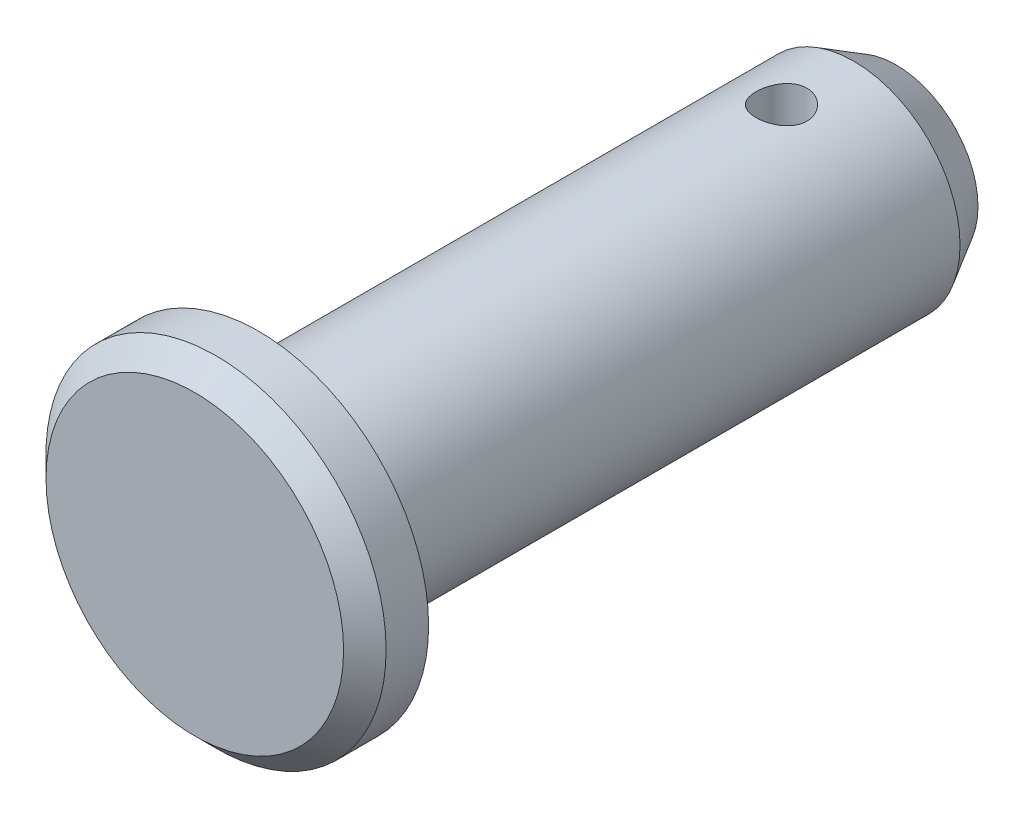
ISO-10303-21;
HEADER;
FILE_DESCRIPTION(('STEP AP214'),'2;1');
FILE_NAME('part.step','',(''),(''),'','','');
FILE_SCHEMA(('AUTOMOTIVE_DESIGN { 1 0 10303 214 1 1 1 1 }'));
ENDSEC;
DATA;
#1=APPLICATION_CONTEXT('core data for automotive mechanical design processes');
#2=APPLICATION_PROTOCOL_DEFINITION('international standard','automotive_design',2000,#1);
#3=PRODUCT_CONTEXT('',#1,'mechanical');
#4=PRODUCT('Part','Part','',(#3));
#5=PRODUCT_RELATED_PRODUCT_CATEGORY('part','',(#4));
#6=PRODUCT_DEFINITION_FORMATION('','',#4);
#7=PRODUCT_DEFINITION_CONTEXT('part definition',#1,'design');
#8=PRODUCT_DEFINITION('design','',#6,#7);
#9=PRODUCT_DEFINITION_SHAPE('','',#8);
#10=(LENGTH_UNIT() NAMED_UNIT(*) SI_UNIT(.MILLI.,.METRE.));
#11=(NAMED_UNIT(*) PLANE_ANGLE_UNIT() SI_UNIT($,.RADIAN.));
#12=(NAMED_UNIT(*) SI_UNIT($,.STERADIAN.) SOLID_ANGLE_UNIT());
#13=UNCERTAINTY_MEASURE_WITH_UNIT(LENGTH_MEASURE(1.E-05),#10,'distance_accuracy_value','');
#14=(GEOMETRIC_REPRESENTATION_CONTEXT(3) GLOBAL_UNCERTAINTY_ASSIGNED_CONTEXT((#13)) GLOBAL_UNIT_ASSIGNED_CONTEXT((#10,
#11,#12)) REPRESENTATION_CONTEXT('',''));
#15=CARTESIAN_POINT('',(0.,0.,0.));
#16=DIRECTION('',(0.,0.,1.));
#17=DIRECTION('',(1.,0.,0.));
#18=AXIS2_PLACEMENT_3D('',#15,#16,#17);
#19=CARTESIAN_POINT('',(0.,0.,8.25));
#20=DIRECTION('',(0.,0.,-1.));
#21=DIRECTION('',(-1.,0.,0.));
#22=AXIS2_PLACEMENT_3D('',#19,#20,#21);
#23=PLANE('',#22);
#24=CARTESIAN_POINT('',(0.,0.,8.25));
#25=DIRECTION('',(0.,0.,1.));
#26=DIRECTION('',(1.,0.,0.));
#27=AXIS2_PLACEMENT_3D('',#24,#25,#26);
#28=CIRCLE('',#27,3.5);
#29=CARTESIAN_POINT('',(3.5,0.,8.25));
#30=VERTEX_POINT('',#29);
#31=EDGE_CURVE('E10',#30,#30,#28,.T.);
#32=ORIENTED_EDGE('',*,*,#31,.T.);
#33=EDGE_LOOP('',(#32));
#34=FACE_BOUND('',#33,.T.);
#35=ADVANCED_FACE('F33',(#34),#23,.F.);
#36=CARTESIAN_POINT('',(0.,0.,7.75));
#37=DIRECTION('',(0.,0.,-1.));
#38=DIRECTION('',(-1.,0.,0.));
#39=AXIS2_PLACEMENT_3D('',#36,#37,#38);
#40=CONICAL_SURFACE('',#39,4.,0.785398163397449);
#41=ORIENTED_EDGE('',*,*,#31,.F.);
#42=EDGE_LOOP('',(#41));
#43=FACE_BOUND('',#42,.T.);
#44=CARTESIAN_POINT('',(0.,0.,7.75));
#45=DIRECTION('',(0.,0.,1.));
#46=DIRECTION('',(1.,0.,0.));
#47=AXIS2_PLACEMENT_3D('',#44,#45,#46);
#48=CIRCLE('',#47,4.);
#49=CARTESIAN_POINT('',(4.,0.,7.75));
#50=VERTEX_POINT('',#49);
#51=EDGE_CURVE('E45',#50,#50,#48,.T.);
#52=ORIENTED_EDGE('',*,*,#51,.T.);
#53=EDGE_LOOP('',(#52));
#54=FACE_BOUND('',#53,.T.);
#55=ADVANCED_FACE('F82',(#43,#54),#40,.T.);
#56=CARTESIAN_POINT('',(0.,0.,8.25));
#57=DIRECTION('',(0.,0.,1.));
#58=DIRECTION('',(1.,0.,0.));
#59=AXIS2_PLACEMENT_3D('',#56,#57,#58);
#60=CYLINDRICAL_SURFACE('',#59,4.);
#61=ORIENTED_EDGE('',*,*,#51,.F.);
#62=EDGE_LOOP('',(#61));
#63=FACE_BOUND('',#62,.T.);
#64=CARTESIAN_POINT('',(0.,0.,6.75));
#65=DIRECTION('',(0.,0.,1.));
#66=DIRECTION('',(1.,0.,0.));
#67=AXIS2_PLACEMENT_3D('',#64,#65,#66);
#68=CIRCLE('',#67,4.);
#69=CARTESIAN_POINT('',(4.,0.,6.75));
#70=VERTEX_POINT('',#69);
#71=EDGE_CURVE('E50',#70,#70,#68,.T.);
#72=ORIENTED_EDGE('',*,*,#71,.T.);
#73=EDGE_LOOP('',(#72));
#74=FACE_BOUND('',#73,.T.);
#75=ADVANCED_FACE('F86',(#63,#74),#60,.T.);
#76=CARTESIAN_POINT('',(0.,0.,6.75));
#77=DIRECTION('',(0.,0.,1.));
#78=DIRECTION('',(1.,0.,0.));
#79=AXIS2_PLACEMENT_3D('',#76,#77,#78);
#80=PLANE('',#79);
#81=ORIENTED_EDGE('',*,*,#71,.F.);
#82=EDGE_LOOP('',(#81));
#83=FACE_BOUND('',#82,.T.);
#84=CARTESIAN_POINT('',(0.,0.,6.75));
#85=DIRECTION('',(0.,0.,1.));
#86=DIRECTION('',(1.,0.,0.));
#87=AXIS2_PLACEMENT_3D('',#84,#85,#86);
#88=CIRCLE('',#87,2.5);
#89=CARTESIAN_POINT('',(2.5,0.,6.75));
#90=VERTEX_POINT('',#89);
#91=EDGE_CURVE('E103',#90,#90,#88,.T.);
#92=ORIENTED_EDGE('',*,*,#91,.T.);
#93=EDGE_LOOP('',(#92));
#94=FACE_BOUND('',#93,.T.);
#95=ADVANCED_FACE('F77',(#83,#94),#80,.F.);
#96=CARTESIAN_POINT('',(0.,0.,8.25));
#97=DIRECTION('',(0.,0.,1.));
#98=DIRECTION('',(1.,0.,0.));
#99=AXIS2_PLACEMENT_3D('',#96,#97,#98);
#100=CYLINDRICAL_SURFACE('',#99,2.5);
#101=CARTESIAN_POINT('',(0.,-2.5,-4.95));
#102=CARTESIAN_POINT('',(0.0331927858057433,-2.49999941429936,-4.95000100481545));
#103=CARTESIAN_POINT('',(0.0663970841856136,-2.49933231269719,-4.95276368204722));
#104=CARTESIAN_POINT('',(0.131856858194276,-2.49673567893865,-4.96372654791908));
#105=CARTESIAN_POINT('',(0.164111736642855,-2.49480536924329,-4.97193008559894));
#106=CARTESIAN_POINT('',(0.226717678942803,-2.48989646416393,-4.99349846690087));
#107=CARTESIAN_POINT('',(0.257070884649645,-2.48691907405693,-5.00685737797152));
#108=CARTESIAN_POINT('',(0.315105035759526,-2.48023450885017,-5.03833708728918));
#109=CARTESIAN_POINT('',(0.342785942950331,-2.47652732331708,-5.05645795361544));
#110=CARTESIAN_POINT('',(0.395218526787946,-2.46870772029608,-5.09731283567512));
#111=CARTESIAN_POINT('',(0.419911904200965,-2.46458944908765,-5.12012055620989));
#112=CARTESIAN_POINT('',(0.46516216162388,-2.45645148740151,-5.16954377381289));
#113=CARTESIAN_POINT('',(0.485718609248959,-2.45243180726688,-5.19615966840804));
#114=CARTESIAN_POINT('',(0.522379987110049,-2.44488759381783,-5.25288916660364));
#115=CARTESIAN_POINT('',(0.538420754095201,-2.44137051632666,-5.28304531675233));
#116=CARTESIAN_POINT('',(0.565183165894594,-2.43531466822854,-5.34572396702514));
#117=CARTESIAN_POINT('',(0.575905588338862,-2.43277575460997,-5.37824612040254));
#118=CARTESIAN_POINT('',(0.591530116217161,-2.42902369357505,-5.44409531465404));
#119=CARTESIAN_POINT('',(0.596536524801647,-2.42778682096375,-5.47739622430902));
#120=CARTESIAN_POINT('',(0.600911617758641,-2.42670779239494,-5.54438647593343));
#121=CARTESIAN_POINT('',(0.600281143364747,-2.4268654283246,-5.57807575919356));
#122=CARTESIAN_POINT('',(0.593483824163744,-2.42853622766859,-5.6440951932023));
#123=CARTESIAN_POINT('',(0.587440206800951,-2.43001921840666,-5.67643891303784));
#124=CARTESIAN_POINT('',(0.570184283274414,-2.43412567479489,-5.73963946332964));
#125=CARTESIAN_POINT('',(0.558971634744064,-2.43674921598782,-5.77049619514691));
#126=CARTESIAN_POINT('',(0.531588242463553,-2.44286953468369,-5.83018259561685));
#127=CARTESIAN_POINT('',(0.515371896493917,-2.44637428651376,-5.85899049058333));
#128=CARTESIAN_POINT('',(0.478473377912768,-2.45385750092533,-5.91352090014452));
#129=CARTESIAN_POINT('',(0.457790480685295,-2.45783604032313,-5.93924291305702));
#130=CARTESIAN_POINT('',(0.411902987817693,-2.46594640514741,-5.98757871406375));
#131=CARTESIAN_POINT('',(0.386594128779816,-2.47007951576017,-6.01009341981244));
#132=CARTESIAN_POINT('',(0.332511184919383,-2.47793903189869,-6.05057694394928));
#133=CARTESIAN_POINT('',(0.303737009964281,-2.481665426841,-6.06854564405852));
#134=CARTESIAN_POINT('',(0.243405695437161,-2.4883078991384,-6.09945944412256));
#135=CARTESIAN_POINT('',(0.211840557392109,-2.49122154116038,-6.11238949124756));
#136=CARTESIAN_POINT('',(0.146899521215735,-2.49589240948309,-6.13273301580972));
#137=CARTESIAN_POINT('',(0.113523942677532,-2.49764983917302,-6.14014746352536));
#138=CARTESIAN_POINT('',(0.0467574799303329,-2.49978055085417,-6.14910041293041));
#139=CARTESIAN_POINT('',(0.0133856961090015,-2.50018564261507,-6.15077397849231));
#140=CARTESIAN_POINT('',(-0.0531608763173256,-2.49965614838947,-6.14856664662982));
#141=CARTESIAN_POINT('',(-0.0863356809529901,-2.4987216729635,-6.14468620760256));
#142=CARTESIAN_POINT('',(-0.15108451602177,-2.49563832790436,-6.13159260429672));
#143=CARTESIAN_POINT('',(-0.182674115862262,-2.49350603180734,-6.12245217808524));
#144=CARTESIAN_POINT('',(-0.24387066002695,-2.4882667003132,-6.09918036166095));
#145=CARTESIAN_POINT('',(-0.273477413328295,-2.48515957116636,-6.0850484914044));
#146=CARTESIAN_POINT('',(-0.330412301991146,-2.47823820299195,-6.05192668128041));
#147=CARTESIAN_POINT('',(-0.357694353480732,-2.47441306356186,-6.03285985661506));
#148=CARTESIAN_POINT('',(-0.408719808193243,-2.46649872813855,-5.99050861419739));
#149=CARTESIAN_POINT('',(-0.432462650148594,-2.46240949041022,-5.9672235287841));
#150=CARTESIAN_POINT('',(-0.476284907579963,-2.45431484285998,-5.91647183375803));
#151=CARTESIAN_POINT('',(-0.496269948095045,-2.45031338527061,-5.88892297558261));
#152=CARTESIAN_POINT('',(-0.531332041647856,-2.44295077593181,-5.83078191442163));
#153=CARTESIAN_POINT('',(-0.546409314445556,-2.43958959551485,-5.80018984778494));
#154=CARTESIAN_POINT('',(-0.571117987036967,-2.43392379045081,-5.7369974972889));
#155=CARTESIAN_POINT('',(-0.580781508775237,-2.43161294950053,-5.70441035930503));
#156=CARTESIAN_POINT('',(-0.59447676057151,-2.42830145351142,-5.6380107629844));
#157=CARTESIAN_POINT('',(-0.598509608550877,-2.42730053840069,-5.60419854924389));
#158=CARTESIAN_POINT('',(-0.600774132897885,-2.42674092435121,-5.53726585994604));
#159=CARTESIAN_POINT('',(-0.599156213184311,-2.42714483266055,-5.50415070073524));
#160=CARTESIAN_POINT('',(-0.590506691252754,-2.42926352922493,-5.43868004715468));
#161=CARTESIAN_POINT('',(-0.583475181800251,-2.43097829501755,-5.40632453977757));
#162=CARTESIAN_POINT('',(-0.564277182607016,-2.43550549953059,-5.34344048949051));
#163=CARTESIAN_POINT('',(-0.552136804091207,-2.43831235121763,-5.31290354548329));
#164=CARTESIAN_POINT('',(-0.52308674716118,-2.44470867225489,-5.25427911722322));
#165=CARTESIAN_POINT('',(-0.506176459869714,-2.44829824150547,-5.22619194628272));
#166=CARTESIAN_POINT('',(-0.467586015416923,-2.45596386510549,-5.17253259997611));
#167=CARTESIAN_POINT('',(-0.445800535958035,-2.46004957395057,-5.14703753538026));
#168=CARTESIAN_POINT('',(-0.398286149546474,-2.46818719662299,-5.10001600238961));
#169=CARTESIAN_POINT('',(-0.372556317748468,-2.47223910228883,-5.07849046735795));
#170=CARTESIAN_POINT('',(-0.31737659976028,-2.4799314059916,-5.03967814808905));
#171=CARTESIAN_POINT('',(-0.287872828718803,-2.48356400402438,-5.0224663189116));
#172=CARTESIAN_POINT('',(-0.226307245657134,-2.48992761221164,-4.99327409345042));
#173=CARTESIAN_POINT('',(-0.194247394738244,-2.4926593054571,-4.98128973132168));
#174=CARTESIAN_POINT('',(-0.135177405138954,-2.49648119802994,-4.96479227497244));
#175=CARTESIAN_POINT('',(-0.108462413253685,-2.49779198899159,-4.95925667684286));
#176=CARTESIAN_POINT('',(-0.0545008454956501,-2.4995516029905,-4.95186024382963));
#177=CARTESIAN_POINT('',(-0.0272543035831555,-2.50000048091363,-4.9499991749549));
#178=CARTESIAN_POINT('',(0.,-2.5,-4.95));
#179=B_SPLINE_CURVE_WITH_KNOTS('',3,(#101,#102,#103,#104,#105,#106,#107,#108,#109,#110,#111,
#112,#113,#114,#115,#116,#117,#118,#119,#120,#121,#122,#123,#124,#125,#126,#127,#128,#129,#130,
#131,#132,#133,#134,#135,#136,#137,#138,#139,#140,#141,#142,#143,#144,#145,#146,#147,#148,#149,
#150,#151,#152,#153,#154,#155,#156,#157,#158,#159,#160,#161,#162,#163,#164,#165,#166,#167,#168,
#169,#170,#171,#172,#173,#174,#175,#176,#177,#178),.UNSPECIFIED.,.T.,.F.,(4,2,2,2,2,2,2,2,2,2,2,
2,2,2,2,2,2,2,2,2,2,2,2,2,2,2,2,2,2,2,2,2,2,2,2,2,2,2,4),(0.,0.0994785198733357,
0.199018329151765,0.298443932817003,0.397870957997039,0.499001140296713,0.600141887066612,
0.702654524101698,0.805152167670075,0.90574799071267,1.00632880134969,1.10467654991844,
1.20303081340704,1.3023093350311,1.40160397488877,1.50349991675263,1.6053985094931,
1.70759922934517,1.80978196626959,1.90954355361041,2.0092969076507,2.10770287472838,
2.20611830841298,2.30617046626465,2.40623847410337,2.5085564904526,2.61086992457631,
2.71256968236638,2.81424924568029,2.91324330907396,3.01223567617591,3.1107281270056,
3.2092331560575,3.31011689218854,3.41102431914531,3.51357948410696,3.6160567091613,
3.69774284605974,3.77942378108273),.UNSPECIFIED.);
#180=CARTESIAN_POINT('',(0.,-2.5,-4.95));
#181=VERTEX_POINT('',#180);
#182=EDGE_CURVE('E36',#181,#181,#179,.T.);
#183=ORIENTED_EDGE('',*,*,#182,.T.);
#184=EDGE_LOOP('',(#183));
#185=FACE_BOUND('',#184,.T.);
#186=CARTESIAN_POINT('',(0.,2.5,-4.95));
#187=CARTESIAN_POINT('',(-0.0331927858057432,2.49999941429936,-4.95000100481545));
#188=CARTESIAN_POINT('',(-0.0663970841856135,2.49933231269719,-4.95276368204722));
#189=CARTESIAN_POINT('',(-0.131856858194276,2.49673567893865,-4.96372654791908));
#190=CARTESIAN_POINT('',(-0.164111736642855,2.49480536924329,-4.97193008559894));
#191=CARTESIAN_POINT('',(-0.226717678942803,2.48989646416393,-4.99349846690087));
#192=CARTESIAN_POINT('',(-0.257070884649645,2.48691907405693,-5.00685737797152));
#193=CARTESIAN_POINT('',(-0.315105035759526,2.48023450885017,-5.03833708728918));
#194=CARTESIAN_POINT('',(-0.342785942950331,2.47652732331708,-5.05645795361544));
#195=CARTESIAN_POINT('',(-0.395218526787946,2.46870772029608,-5.09731283567512));
#196=CARTESIAN_POINT('',(-0.419911904200964,2.46458944908765,-5.12012055620989));
#197=CARTESIAN_POINT('',(-0.46516216162388,2.45645148740151,-5.16954377381289));
#198=CARTESIAN_POINT('',(-0.485718609248959,2.45243180726688,-5.19615966840804));
#199=CARTESIAN_POINT('',(-0.522379987110048,2.44488759381783,-5.25288916660364));
#200=CARTESIAN_POINT('',(-0.538420754095201,2.44137051632666,-5.28304531675233));
#201=CARTESIAN_POINT('',(-0.565183165894594,2.43531466822854,-5.34572396702514));
#202=CARTESIAN_POINT('',(-0.575905588338861,2.43277575460997,-5.37824612040254));
#203=CARTESIAN_POINT('',(-0.59153011621716,2.42902369357505,-5.44409531465404));
#204=CARTESIAN_POINT('',(-0.596536524801647,2.42778682096375,-5.47739622430902));
#205=CARTESIAN_POINT('',(-0.600911617758641,2.42670779239494,-5.54438647593343));
#206=CARTESIAN_POINT('',(-0.600281143364747,2.4268654283246,-5.57807575919356));
#207=CARTESIAN_POINT('',(-0.593483824163744,2.42853622766859,-5.6440951932023));
#208=CARTESIAN_POINT('',(-0.587440206800951,2.43001921840667,-5.67643891303784));
#209=CARTESIAN_POINT('',(-0.570184283274415,2.43412567479489,-5.73963946332964));
#210=CARTESIAN_POINT('',(-0.558971634744064,2.43674921598782,-5.77049619514691));
#211=CARTESIAN_POINT('',(-0.531588242463554,2.44286953468369,-5.83018259561685));
#212=CARTESIAN_POINT('',(-0.515371896493918,2.44637428651376,-5.85899049058333));
#213=CARTESIAN_POINT('',(-0.478473377912769,2.45385750092533,-5.91352090014452));
#214=CARTESIAN_POINT('',(-0.457790480685296,2.45783604032313,-5.93924291305702));
#215=CARTESIAN_POINT('',(-0.411902987817693,2.46594640514741,-5.98757871406375));
#216=CARTESIAN_POINT('',(-0.386594128779816,2.47007951576017,-6.01009341981244));
#217=CARTESIAN_POINT('',(-0.332511184919383,2.47793903189869,-6.05057694394928));
#218=CARTESIAN_POINT('',(-0.303737009964281,2.481665426841,-6.06854564405852));
#219=CARTESIAN_POINT('',(-0.243405695437162,2.48830789913841,-6.09945944412256));
#220=CARTESIAN_POINT('',(-0.211840557392109,2.49122154116038,-6.11238949124756));
#221=CARTESIAN_POINT('',(-0.146899521215735,2.49589240948309,-6.13273301580972));
#222=CARTESIAN_POINT('',(-0.113523942677533,2.49764983917302,-6.14014746352536));
#223=CARTESIAN_POINT('',(-0.046757479930333,2.49978055085417,-6.14910041293041));
#224=CARTESIAN_POINT('',(-0.0133856961090016,2.50018564261507,-6.15077397849231));
#225=CARTESIAN_POINT('',(0.0531608763173256,2.49965614838947,-6.14856664662982));
#226=CARTESIAN_POINT('',(0.0863356809529899,2.4987216729635,-6.14468620760256));
#227=CARTESIAN_POINT('',(0.151084516021769,2.49563832790436,-6.13159260429672));
#228=CARTESIAN_POINT('',(0.182674115862262,2.49350603180734,-6.12245217808524));
#229=CARTESIAN_POINT('',(0.24387066002695,2.4882667003132,-6.09918036166095));
#230=CARTESIAN_POINT('',(0.273477413328294,2.48515957116636,-6.0850484914044));
#231=CARTESIAN_POINT('',(0.330412301991146,2.47823820299195,-6.05192668128041));
#232=CARTESIAN_POINT('',(0.357694353480732,2.47441306356186,-6.03285985661506));
#233=CARTESIAN_POINT('',(0.408719808193243,2.46649872813855,-5.99050861419739));
#234=CARTESIAN_POINT('',(0.432462650148594,2.46240949041022,-5.9672235287841));
#235=CARTESIAN_POINT('',(0.476284907579963,2.45431484285998,-5.91647183375803));
#236=CARTESIAN_POINT('',(0.496269948095045,2.45031338527061,-5.88892297558261));
#237=CARTESIAN_POINT('',(0.531332041647856,2.44295077593181,-5.83078191442163));
#238=CARTESIAN_POINT('',(0.546409314445556,2.43958959551485,-5.80018984778494));
#239=CARTESIAN_POINT('',(0.571117987036967,2.43392379045081,-5.7369974972889));
#240=CARTESIAN_POINT('',(0.580781508775237,2.43161294950052,-5.70441035930503));
#241=CARTESIAN_POINT('',(0.594476760571509,2.42830145351142,-5.6380107629844));
#242=CARTESIAN_POINT('',(0.598509608550877,2.42730053840068,-5.60419854924389));
#243=CARTESIAN_POINT('',(0.600774132897885,2.42674092435121,-5.53726585994604));
#244=CARTESIAN_POINT('',(0.599156213184311,2.42714483266054,-5.50415070073524));
#245=CARTESIAN_POINT('',(0.590506691252754,2.42926352922492,-5.43868004715468));
#246=CARTESIAN_POINT('',(0.583475181800251,2.43097829501755,-5.40632453977757));
#247=CARTESIAN_POINT('',(0.564277182607016,2.43550549953059,-5.34344048949051));
#248=CARTESIAN_POINT('',(0.552136804091207,2.43831235121763,-5.31290354548329));
#249=CARTESIAN_POINT('',(0.523086747161181,2.44470867225489,-5.25427911722322));
#250=CARTESIAN_POINT('',(0.506176459869714,2.44829824150546,-5.22619194628272));
#251=CARTESIAN_POINT('',(0.467586015416923,2.45596386510549,-5.17253259997611));
#252=CARTESIAN_POINT('',(0.445800535958036,2.46004957395057,-5.14703753538026));
#253=CARTESIAN_POINT('',(0.398286149546474,2.46818719662299,-5.10001600238961));
#254=CARTESIAN_POINT('',(0.372556317748468,2.47223910228883,-5.07849046735795));
#255=CARTESIAN_POINT('',(0.31737659976028,2.4799314059916,-5.03967814808905));
#256=CARTESIAN_POINT('',(0.287872828718803,2.48356400402438,-5.0224663189116));
#257=CARTESIAN_POINT('',(0.226307245657134,2.48992761221164,-4.99327409345042));
#258=CARTESIAN_POINT('',(0.194247394738244,2.4926593054571,-4.98128973132168));
#259=CARTESIAN_POINT('',(0.135177405138954,2.49648119802994,-4.96479227497244));
#260=CARTESIAN_POINT('',(0.108462413253685,2.49779198899159,-4.95925667684286));
#261=CARTESIAN_POINT('',(0.0545008454956502,2.4995516029905,-4.95186024382963));
#262=CARTESIAN_POINT('',(0.0272543035831556,2.50000048091363,-4.9499991749549));
#263=CARTESIAN_POINT('',(0.,2.5,-4.95));
#264=B_SPLINE_CURVE_WITH_KNOTS('',3,(#186,#187,#188,#189,#190,#191,#192,#193,#194,#195,#196,
#197,#198,#199,#200,#201,#202,#203,#204,#205,#206,#207,#208,#209,#210,#211,#212,#213,#214,#215,
#216,#217,#218,#219,#220,#221,#222,#223,#224,#225,#226,#227,#228,#229,#230,#231,#232,#233,#234,
#235,#236,#237,#238,#239,#240,#241,#242,#243,#244,#245,#246,#247,#248,#249,#250,#251,#252,#253,
#254,#255,#256,#257,#258,#259,#260,#261,#262,#263),.UNSPECIFIED.,.T.,.F.,(4,2,2,2,2,2,2,2,2,2,2,
2,2,2,2,2,2,2,2,2,2,2,2,2,2,2,2,2,2,2,2,2,2,2,2,2,2,2,4),(0.,0.0994785198733357,
0.199018329151765,0.298443932817003,0.397870957997039,0.499001140296712,0.600141887066612,
0.702654524101697,0.805152167670074,0.90574799071267,1.00632880134969,1.10467654991844,
1.20303081340704,1.3023093350311,1.40160397488877,1.50349991675263,1.6053985094931,
1.70759922934517,1.80978196626959,1.90954355361041,2.0092969076507,2.10770287472838,
2.20611830841298,2.30617046626465,2.40623847410337,2.5085564904526,2.61086992457631,
2.71256968236638,2.81424924568029,2.91324330907396,3.01223567617591,3.1107281270056,
3.2092331560575,3.31011689218854,3.41102431914531,3.51357948410696,3.6160567091613,
3.69774284605974,3.77942378108273),.UNSPECIFIED.);
#265=CARTESIAN_POINT('',(0.,2.5,-4.95));
#266=VERTEX_POINT('',#265);
#267=EDGE_CURVE('E53',#266,#266,#264,.T.);
#268=ORIENTED_EDGE('',*,*,#267,.T.);
#269=EDGE_LOOP('',(#268));
#270=FACE_BOUND('',#269,.T.);
#271=ORIENTED_EDGE('',*,*,#91,.F.);
#272=EDGE_LOOP('',(#271));
#273=FACE_BOUND('',#272,.T.);
#274=CARTESIAN_POINT('',(0.,0.,-7.25));
#275=DIRECTION('',(0.,0.,1.));
#276=DIRECTION('',(1.,0.,0.));
#277=AXIS2_PLACEMENT_3D('',#274,#275,#276);
#278=CIRCLE('',#277,2.5);
#279=CARTESIAN_POINT('',(2.5,0.,-7.25));
#280=VERTEX_POINT('',#279);
#281=EDGE_CURVE('E105',#280,#280,#278,.T.);
#282=ORIENTED_EDGE('',*,*,#281,.T.);
#283=EDGE_LOOP('',(#282));
#284=FACE_BOUND('',#283,.T.);
#285=ADVANCED_FACE('F58',(#185,#270,#273,#284),#100,.T.);
#286=CARTESIAN_POINT('',(0.,0.,-8.25));
#287=DIRECTION('',(0.,0.,1.));
#288=DIRECTION('',(1.,0.,0.));
#289=AXIS2_PLACEMENT_3D('',#286,#287,#288);
#290=CONICAL_SURFACE('',#289,1.92264973081038,0.523598775598298);
#291=ORIENTED_EDGE('',*,*,#281,.F.);
#292=EDGE_LOOP('',(#291));
#293=FACE_BOUND('',#292,.T.);
#294=CARTESIAN_POINT('',(0.,0.,-8.25));
#295=DIRECTION('',(0.,0.,1.));
#296=DIRECTION('',(1.,0.,0.));
#297=AXIS2_PLACEMENT_3D('',#294,#295,#296);
#298=CIRCLE('',#297,1.92264973081038);
#299=CARTESIAN_POINT('',(1.92264973081037,0.,-8.25));
#300=VERTEX_POINT('',#299);
#301=EDGE_CURVE('E108',#300,#300,#298,.T.);
#302=ORIENTED_EDGE('',*,*,#301,.T.);
#303=EDGE_LOOP('',(#302));
#304=FACE_BOUND('',#303,.T.);
#305=ADVANCED_FACE('F70',(#293,#304),#290,.T.);
#306=CARTESIAN_POINT('',(0.,0.,-8.25));
#307=DIRECTION('',(0.,0.,1.));
#308=DIRECTION('',(1.,0.,0.));
#309=AXIS2_PLACEMENT_3D('',#306,#307,#308);
#310=PLANE('',#309);
#311=ORIENTED_EDGE('',*,*,#301,.F.);
#312=EDGE_LOOP('',(#311));
#313=FACE_BOUND('',#312,.T.);
#314=ADVANCED_FACE('F66',(#313),#310,.F.);
#315=CARTESIAN_POINT('',(0.,-4.,-5.55));
#316=DIRECTION('',(0.,1.,0.));
#317=DIRECTION('',(0.,0.,1.));
#318=AXIS2_PLACEMENT_3D('',#315,#316,#317);
#319=CYLINDRICAL_SURFACE('',#318,0.6);
#320=ORIENTED_EDGE('',*,*,#267,.F.);
#321=EDGE_LOOP('',(#320));
#322=FACE_BOUND('',#321,.T.);
#323=ORIENTED_EDGE('',*,*,#182,.F.);
#324=EDGE_LOOP('',(#323));
#325=FACE_BOUND('',#324,.T.);
#326=ADVANCED_FACE('F62',(#322,#325),#319,.F.);
#327=CLOSED_SHELL('',(#35,#55,#75,#95,#285,#305,#314,#326));
#328=MANIFOLD_SOLID_BREP('B2',#327);
#329=ADVANCED_BREP_SHAPE_REPRESENTATION('',(#18,#328),#14);
#330=SHAPE_DEFINITION_REPRESENTATION(#9,#329);
ENDSEC;
END-ISO-10303-21;
